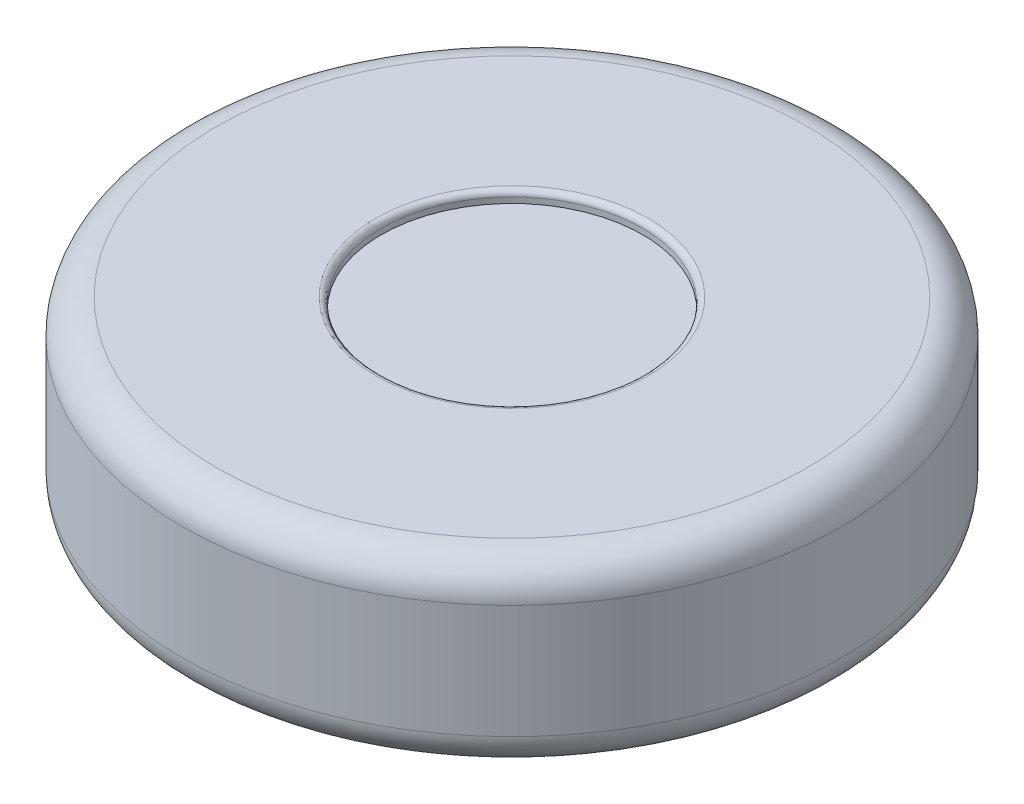
ISO-10303-21;
HEADER;
FILE_DESCRIPTION(('STEP AP214'),'2;1');
FILE_NAME('part.step','',(''),(''),'','','');
FILE_SCHEMA(('AUTOMOTIVE_DESIGN { 1 0 10303 214 1 1 1 1 }'));
ENDSEC;
DATA;
#1=APPLICATION_CONTEXT('core data for automotive mechanical design processes');
#2=APPLICATION_PROTOCOL_DEFINITION('international standard','automotive_design',2000,#1);
#3=PRODUCT_CONTEXT('',#1,'mechanical');
#4=PRODUCT('Part','Part','',(#3));
#5=PRODUCT_RELATED_PRODUCT_CATEGORY('part','',(#4));
#6=PRODUCT_DEFINITION_FORMATION('','',#4);
#7=PRODUCT_DEFINITION_CONTEXT('part definition',#1,'design');
#8=PRODUCT_DEFINITION('design','',#6,#7);
#9=PRODUCT_DEFINITION_SHAPE('','',#8);
#10=(LENGTH_UNIT() NAMED_UNIT(*) SI_UNIT(.MILLI.,.METRE.));
#11=(NAMED_UNIT(*) PLANE_ANGLE_UNIT() SI_UNIT($,.RADIAN.));
#12=(NAMED_UNIT(*) SI_UNIT($,.STERADIAN.) SOLID_ANGLE_UNIT());
#13=UNCERTAINTY_MEASURE_WITH_UNIT(LENGTH_MEASURE(1.E-05),#10,'distance_accuracy_value','');
#14=(GEOMETRIC_REPRESENTATION_CONTEXT(3) GLOBAL_UNCERTAINTY_ASSIGNED_CONTEXT((#13)) GLOBAL_UNIT_ASSIGNED_CONTEXT((#10,
#11,#12)) REPRESENTATION_CONTEXT('',''));
#15=CARTESIAN_POINT('',(0.,0.,0.));
#16=DIRECTION('',(0.,0.,1.));
#17=DIRECTION('',(1.,0.,0.));
#18=AXIS2_PLACEMENT_3D('',#15,#16,#17);
#19=CARTESIAN_POINT('',(0.,140.,0.));
#20=DIRECTION('',(0.,1.,0.));
#21=DIRECTION('',(0.,0.,1.));
#22=AXIS2_PLACEMENT_3D('',#19,#20,#21);
#23=PLANE('',#22);
#24=CARTESIAN_POINT('',(0.,140.,0.));
#25=DIRECTION('',(0.,1.,0.));
#26=DIRECTION('',(0.,0.,1.));
#27=AXIS2_PLACEMENT_3D('',#24,#25,#26);
#28=CIRCLE('',#27,115.);
#29=CARTESIAN_POINT('',(0.,140.,115.));
#30=VERTEX_POINT('',#29);
#31=EDGE_CURVE('E66',#30,#30,#28,.T.);
#32=ORIENTED_EDGE('',*,*,#31,.T.);
#33=EDGE_LOOP('',(#32));
#34=FACE_BOUND('',#33,.T.);
#35=ADVANCED_FACE('F31',(#34),#23,.T.);
#36=CARTESIAN_POINT('',(0.,-9.99999999999999,0.));
#37=DIRECTION('',(0.,1.,0.));
#38=DIRECTION('',(0.,0.,1.));
#39=AXIS2_PLACEMENT_3D('',#36,#37,#38);
#40=CYLINDRICAL_SURFACE('',#39,115.);
#41=CARTESIAN_POINT('',(0.,-4.99999999999999,0.));
#42=DIRECTION('',(0.,1.,0.));
#43=DIRECTION('',(0.,0.,1.));
#44=AXIS2_PLACEMENT_3D('',#41,#42,#43);
#45=CIRCLE('',#44,115.);
#46=CARTESIAN_POINT('',(0.,-4.99999999999999,115.));
#47=VERTEX_POINT('',#46);
#48=EDGE_CURVE('E42',#47,#47,#45,.F.);
#49=ORIENTED_EDGE('',*,*,#48,.T.);
#50=EDGE_LOOP('',(#49));
#51=FACE_BOUND('',#50,.T.);
#52=CARTESIAN_POINT('',(0.,0.,0.));
#53=DIRECTION('',(0.,1.,0.));
#54=DIRECTION('',(0.,0.,1.));
#55=AXIS2_PLACEMENT_3D('',#52,#53,#54);
#56=CIRCLE('',#55,115.);
#57=CARTESIAN_POINT('',(0.,0.,115.));
#58=VERTEX_POINT('',#57);
#59=EDGE_CURVE('E63',#58,#58,#56,.T.);
#60=ORIENTED_EDGE('',*,*,#59,.T.);
#61=EDGE_LOOP('',(#60));
#62=FACE_BOUND('',#61,.T.);
#63=ADVANCED_FACE('F76',(#51,#62),#40,.F.);
#64=CARTESIAN_POINT('',(0.,-9.99999999999999,0.));
#65=DIRECTION('',(0.,1.,0.));
#66=DIRECTION('',(0.,0.,1.));
#67=AXIS2_PLACEMENT_3D('',#64,#65,#66);
#68=CYLINDRICAL_SURFACE('',#67,290.);
#69=CARTESIAN_POINT('',(0.,120.,0.));
#70=DIRECTION('',(0.,1.,0.));
#71=DIRECTION('',(0.,0.,1.));
#72=AXIS2_PLACEMENT_3D('',#69,#70,#71);
#73=CIRCLE('',#72,290.);
#74=CARTESIAN_POINT('',(0.,120.,290.));
#75=VERTEX_POINT('',#74);
#76=EDGE_CURVE('E54',#75,#75,#73,.F.);
#77=ORIENTED_EDGE('',*,*,#76,.T.);
#78=EDGE_LOOP('',(#77));
#79=FACE_BOUND('',#78,.T.);
#80=CARTESIAN_POINT('',(0.,20.,0.));
#81=DIRECTION('',(0.,1.,0.));
#82=DIRECTION('',(0.,0.,1.));
#83=AXIS2_PLACEMENT_3D('',#80,#81,#82);
#84=CIRCLE('',#83,290.);
#85=CARTESIAN_POINT('',(0.,20.,290.));
#86=VERTEX_POINT('',#85);
#87=EDGE_CURVE('E57',#86,#86,#84,.T.);
#88=ORIENTED_EDGE('',*,*,#87,.T.);
#89=EDGE_LOOP('',(#88));
#90=FACE_BOUND('',#89,.T.);
#91=ADVANCED_FACE('F83',(#79,#90),#68,.T.);
#92=CARTESIAN_POINT('',(0.,-9.99999999999999,0.));
#93=DIRECTION('',(0.,1.,0.));
#94=DIRECTION('',(0.,0.,1.));
#95=AXIS2_PLACEMENT_3D('',#92,#93,#94);
#96=PLANE('',#95);
#97=CARTESIAN_POINT('',(0.,-9.99999999999999,0.));
#98=DIRECTION('',(0.,1.,0.));
#99=DIRECTION('',(0.,0.,1.));
#100=AXIS2_PLACEMENT_3D('',#97,#98,#99);
#101=CIRCLE('',#100,120.);
#102=CARTESIAN_POINT('',(0.,-9.99999999999999,120.));
#103=VERTEX_POINT('',#102);
#104=EDGE_CURVE('E46',#103,#103,#101,.T.);
#105=ORIENTED_EDGE('',*,*,#104,.T.);
#106=EDGE_LOOP('',(#105));
#107=FACE_BOUND('',#106,.T.);
#108=CARTESIAN_POINT('',(0.,-9.99999999999999,0.));
#109=DIRECTION('',(0.,1.,0.));
#110=DIRECTION('',(0.,0.,1.));
#111=AXIS2_PLACEMENT_3D('',#108,#109,#110);
#112=CIRCLE('',#111,260.);
#113=CARTESIAN_POINT('',(0.,-9.99999999999999,260.));
#114=VERTEX_POINT('',#113);
#115=EDGE_CURVE('E51',#114,#114,#112,.F.);
#116=ORIENTED_EDGE('',*,*,#115,.T.);
#117=EDGE_LOOP('',(#116));
#118=FACE_BOUND('',#117,.T.);
#119=ADVANCED_FACE('F74',(#107,#118),#96,.F.);
#120=CARTESIAN_POINT('',(0.,145.,0.));
#121=DIRECTION('',(0.,1.,0.));
#122=DIRECTION('',(0.,0.,1.));
#123=AXIS2_PLACEMENT_3D('',#120,#121,#122);
#124=CIRCLE('',#123,115.);
#125=CARTESIAN_POINT('',(0.,145.,115.));
#126=VERTEX_POINT('',#125);
#127=EDGE_CURVE('E38',#126,#126,#124,.T.);
#128=ORIENTED_EDGE('',*,*,#127,.T.);
#129=EDGE_LOOP('',(#128));
#130=FACE_BOUND('',#129,.T.);
#131=ORIENTED_EDGE('',*,*,#31,.F.);
#132=EDGE_LOOP('',(#131));
#133=FACE_BOUND('',#132,.T.);
#134=ADVANCED_FACE('F71',(#130,#133),#40,.F.);
#135=CARTESIAN_POINT('',(0.,150.,0.));
#136=DIRECTION('',(0.,1.,0.));
#137=DIRECTION('',(0.,0.,1.));
#138=AXIS2_PLACEMENT_3D('',#135,#136,#137);
#139=PLANE('',#138);
#140=CARTESIAN_POINT('',(0.,150.,0.));
#141=DIRECTION('',(0.,1.,0.));
#142=DIRECTION('',(0.,0.,1.));
#143=AXIS2_PLACEMENT_3D('',#140,#141,#142);
#144=CIRCLE('',#143,120.);
#145=CARTESIAN_POINT('',(0.,150.,120.));
#146=VERTEX_POINT('',#145);
#147=EDGE_CURVE('E10',#146,#146,#144,.F.);
#148=ORIENTED_EDGE('',*,*,#147,.T.);
#149=EDGE_LOOP('',(#148));
#150=FACE_BOUND('',#149,.T.);
#151=CARTESIAN_POINT('',(0.,150.,0.));
#152=DIRECTION('',(0.,1.,0.));
#153=DIRECTION('',(0.,0.,1.));
#154=AXIS2_PLACEMENT_3D('',#151,#152,#153);
#155=CIRCLE('',#154,260.);
#156=CARTESIAN_POINT('',(0.,150.,260.));
#157=VERTEX_POINT('',#156);
#158=EDGE_CURVE('E60',#157,#157,#155,.T.);
#159=ORIENTED_EDGE('',*,*,#158,.T.);
#160=EDGE_LOOP('',(#159));
#161=FACE_BOUND('',#160,.T.);
#162=ADVANCED_FACE('F73',(#150,#161),#139,.T.);
#163=CARTESIAN_POINT('',(0.,0.,0.));
#164=DIRECTION('',(0.,1.,0.));
#165=DIRECTION('',(0.,0.,1.));
#166=AXIS2_PLACEMENT_3D('',#163,#164,#165);
#167=PLANE('',#166);
#168=ORIENTED_EDGE('',*,*,#59,.F.);
#169=EDGE_LOOP('',(#168));
#170=FACE_BOUND('',#169,.T.);
#171=ADVANCED_FACE('F81',(#170),#167,.F.);
#172=CARTESIAN_POINT('',(0.,120.,0.));
#173=DIRECTION('',(0.,1.,0.));
#174=DIRECTION('',(0.,0.,1.));
#175=AXIS2_PLACEMENT_3D('',#172,#173,#174);
#176=TOROIDAL_SURFACE('',#175,260.,30.);
#177=ORIENTED_EDGE('',*,*,#76,.F.);
#178=EDGE_LOOP('',(#177));
#179=FACE_BOUND('',#178,.T.);
#180=ORIENTED_EDGE('',*,*,#158,.F.);
#181=EDGE_LOOP('',(#180));
#182=FACE_BOUND('',#181,.T.);
#183=ADVANCED_FACE('F96',(#179,#182),#176,.T.);
#184=CARTESIAN_POINT('',(0.,20.,0.));
#185=DIRECTION('',(0.,1.,0.));
#186=DIRECTION('',(0.,0.,1.));
#187=AXIS2_PLACEMENT_3D('',#184,#185,#186);
#188=TOROIDAL_SURFACE('',#187,260.,30.);
#189=ORIENTED_EDGE('',*,*,#115,.F.);
#190=EDGE_LOOP('',(#189));
#191=FACE_BOUND('',#190,.T.);
#192=ORIENTED_EDGE('',*,*,#87,.F.);
#193=EDGE_LOOP('',(#192));
#194=FACE_BOUND('',#193,.T.);
#195=ADVANCED_FACE('F100',(#191,#194),#188,.T.);
#196=CARTESIAN_POINT('',(0.,-4.99999999999999,0.));
#197=DIRECTION('',(0.,1.,0.));
#198=DIRECTION('',(0.,0.,1.));
#199=AXIS2_PLACEMENT_3D('',#196,#197,#198);
#200=TOROIDAL_SURFACE('',#199,120.,5.);
#201=ORIENTED_EDGE('',*,*,#48,.F.);
#202=EDGE_LOOP('',(#201));
#203=FACE_BOUND('',#202,.T.);
#204=ORIENTED_EDGE('',*,*,#104,.F.);
#205=EDGE_LOOP('',(#204));
#206=FACE_BOUND('',#205,.T.);
#207=ADVANCED_FACE('F103',(#203,#206),#200,.T.);
#208=CARTESIAN_POINT('',(0.,145.,0.));
#209=DIRECTION('',(0.,1.,0.));
#210=DIRECTION('',(0.,0.,1.));
#211=AXIS2_PLACEMENT_3D('',#208,#209,#210);
#212=TOROIDAL_SURFACE('',#211,120.,5.);
#213=ORIENTED_EDGE('',*,*,#147,.F.);
#214=EDGE_LOOP('',(#213));
#215=FACE_BOUND('',#214,.T.);
#216=ORIENTED_EDGE('',*,*,#127,.F.);
#217=EDGE_LOOP('',(#216));
#218=FACE_BOUND('',#217,.T.);
#219=ADVANCED_FACE('F33',(#215,#218),#212,.T.);
#220=CLOSED_SHELL('',(#35,#63,#91,#119,#134,#162,#171,#183,#195,#207,#219));
#221=MANIFOLD_SOLID_BREP('B2',#220);
#222=ADVANCED_BREP_SHAPE_REPRESENTATION('',(#18,#221),#14);
#223=SHAPE_DEFINITION_REPRESENTATION(#9,#222);
ENDSEC;
END-ISO-10303-21;
